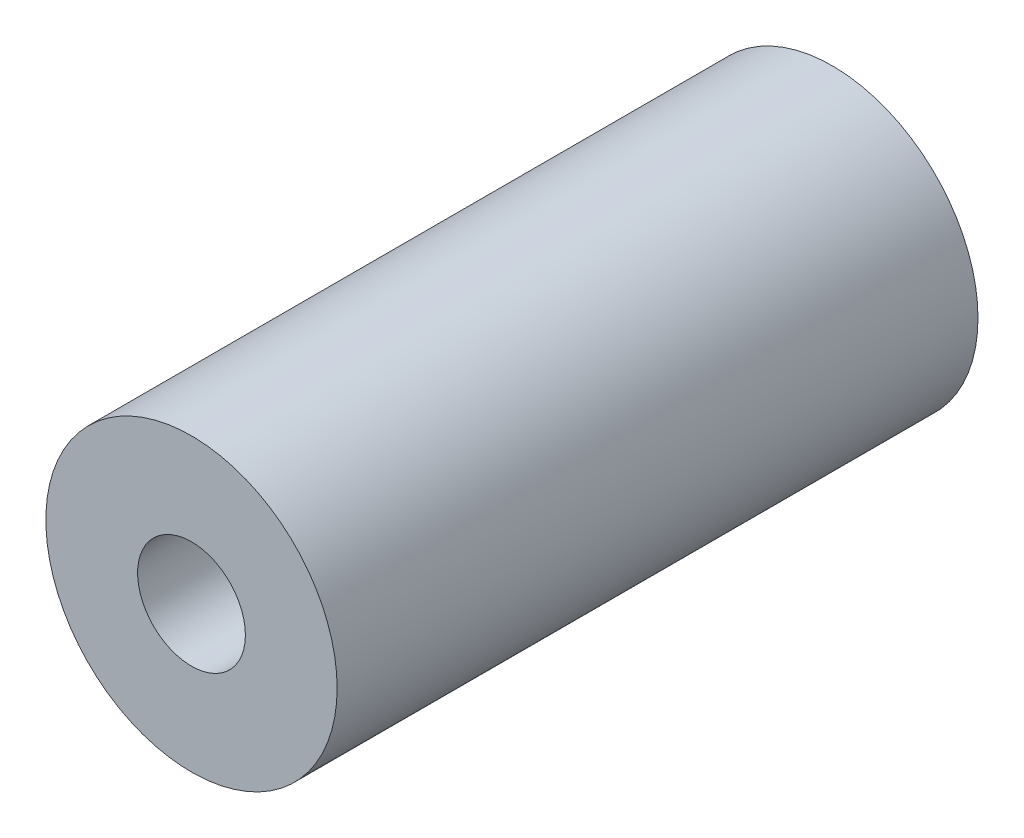
ISO-10303-21;
HEADER;
FILE_DESCRIPTION(('STEP AP214'),'2;1');
FILE_NAME('part.step','',(''),(''),'','','');
FILE_SCHEMA(('AUTOMOTIVE_DESIGN { 1 0 10303 214 1 1 1 1 }'));
ENDSEC;
DATA;
#1=APPLICATION_CONTEXT('core data for automotive mechanical design processes');
#2=APPLICATION_PROTOCOL_DEFINITION('international standard','automotive_design',2000,#1);
#3=PRODUCT_CONTEXT('',#1,'mechanical');
#4=PRODUCT('Part','Part','',(#3));
#5=PRODUCT_RELATED_PRODUCT_CATEGORY('part','',(#4));
#6=PRODUCT_DEFINITION_FORMATION('','',#4);
#7=PRODUCT_DEFINITION_CONTEXT('part definition',#1,'design');
#8=PRODUCT_DEFINITION('design','',#6,#7);
#9=PRODUCT_DEFINITION_SHAPE('','',#8);
#10=(LENGTH_UNIT() NAMED_UNIT(*) SI_UNIT(.MILLI.,.METRE.));
#11=(NAMED_UNIT(*) PLANE_ANGLE_UNIT() SI_UNIT($,.RADIAN.));
#12=(NAMED_UNIT(*) SI_UNIT($,.STERADIAN.) SOLID_ANGLE_UNIT());
#13=UNCERTAINTY_MEASURE_WITH_UNIT(LENGTH_MEASURE(1.E-05),#10,'distance_accuracy_value','');
#14=(GEOMETRIC_REPRESENTATION_CONTEXT(3) GLOBAL_UNCERTAINTY_ASSIGNED_CONTEXT((#13)) GLOBAL_UNIT_ASSIGNED_CONTEXT((#10,
#11,#12)) REPRESENTATION_CONTEXT('',''));
#15=CARTESIAN_POINT('',(0.,0.,0.));
#16=DIRECTION('',(0.,0.,1.));
#17=DIRECTION('',(1.,0.,0.));
#18=AXIS2_PLACEMENT_3D('',#15,#16,#17);
#19=CARTESIAN_POINT('',(0.,0.,22.));
#20=DIRECTION('',(0.,0.,1.));
#21=DIRECTION('',(1.,0.,0.));
#22=AXIS2_PLACEMENT_3D('',#19,#20,#21);
#23=PLANE('',#22);
#24=CARTESIAN_POINT('',(0.,0.,22.));
#25=DIRECTION('',(0.,0.,1.));
#26=DIRECTION('',(1.,0.,0.));
#27=AXIS2_PLACEMENT_3D('',#24,#25,#26);
#28=CIRCLE('',#27,5.);
#29=CARTESIAN_POINT('',(5.,0.,22.));
#30=VERTEX_POINT('',#29);
#31=EDGE_CURVE('E10',#30,#30,#28,.T.);
#32=ORIENTED_EDGE('',*,*,#31,.T.);
#33=EDGE_LOOP('',(#32));
#34=FACE_BOUND('',#33,.T.);
#35=CARTESIAN_POINT('',(0.,0.,22.));
#36=DIRECTION('',(0.,0.,1.));
#37=DIRECTION('',(1.,0.,0.));
#38=AXIS2_PLACEMENT_3D('',#35,#36,#37);
#39=CIRCLE('',#38,1.85);
#40=CARTESIAN_POINT('',(1.85,0.,22.));
#41=VERTEX_POINT('',#40);
#42=EDGE_CURVE('E42',#41,#41,#39,.T.);
#43=ORIENTED_EDGE('',*,*,#42,.F.);
#44=EDGE_LOOP('',(#43));
#45=FACE_BOUND('',#44,.T.);
#46=ADVANCED_FACE('F31',(#34,#45),#23,.T.);
#47=CARTESIAN_POINT('',(0.,0.,0.));
#48=DIRECTION('',(0.,0.,1.));
#49=DIRECTION('',(1.,0.,0.));
#50=AXIS2_PLACEMENT_3D('',#47,#48,#49);
#51=PLANE('',#50);
#52=CARTESIAN_POINT('',(0.,0.,0.));
#53=DIRECTION('',(0.,0.,1.));
#54=DIRECTION('',(1.,0.,0.));
#55=AXIS2_PLACEMENT_3D('',#52,#53,#54);
#56=CIRCLE('',#55,5.);
#57=CARTESIAN_POINT('',(5.,0.,0.));
#58=VERTEX_POINT('',#57);
#59=EDGE_CURVE('E35',#58,#58,#56,.T.);
#60=ORIENTED_EDGE('',*,*,#59,.F.);
#61=EDGE_LOOP('',(#60));
#62=FACE_BOUND('',#61,.T.);
#63=CARTESIAN_POINT('',(0.,0.,0.));
#64=DIRECTION('',(0.,0.,1.));
#65=DIRECTION('',(1.,0.,0.));
#66=AXIS2_PLACEMENT_3D('',#63,#64,#65);
#67=CIRCLE('',#66,1.85);
#68=CARTESIAN_POINT('',(1.85,0.,0.));
#69=VERTEX_POINT('',#68);
#70=EDGE_CURVE('E44',#69,#69,#67,.T.);
#71=ORIENTED_EDGE('',*,*,#70,.T.);
#72=EDGE_LOOP('',(#71));
#73=FACE_BOUND('',#72,.T.);
#74=ADVANCED_FACE('F54',(#62,#73),#51,.F.);
#75=CARTESIAN_POINT('',(0.,0.,22.));
#76=DIRECTION('',(0.,0.,-1.));
#77=DIRECTION('',(-1.,0.,0.));
#78=AXIS2_PLACEMENT_3D('',#75,#76,#77);
#79=CYLINDRICAL_SURFACE('',#78,5.);
#80=ORIENTED_EDGE('',*,*,#31,.F.);
#81=EDGE_LOOP('',(#80));
#82=FACE_BOUND('',#81,.T.);
#83=ORIENTED_EDGE('',*,*,#59,.T.);
#84=EDGE_LOOP('',(#83));
#85=FACE_BOUND('',#84,.T.);
#86=ADVANCED_FACE('F33',(#82,#85),#79,.T.);
#87=CARTESIAN_POINT('',(0.,0.,22.));
#88=DIRECTION('',(0.,0.,-1.));
#89=DIRECTION('',(-1.,0.,0.));
#90=AXIS2_PLACEMENT_3D('',#87,#88,#89);
#91=CYLINDRICAL_SURFACE('',#90,1.85);
#92=ORIENTED_EDGE('',*,*,#42,.T.);
#93=EDGE_LOOP('',(#92));
#94=FACE_BOUND('',#93,.T.);
#95=ORIENTED_EDGE('',*,*,#70,.F.);
#96=EDGE_LOOP('',(#95));
#97=FACE_BOUND('',#96,.T.);
#98=ADVANCED_FACE('F50',(#94,#97),#91,.F.);
#99=CLOSED_SHELL('',(#46,#74,#86,#98));
#100=MANIFOLD_SOLID_BREP('B2',#99);
#101=ADVANCED_BREP_SHAPE_REPRESENTATION('',(#18,#100),#14);
#102=SHAPE_DEFINITION_REPRESENTATION(#9,#101);
ENDSEC;
END-ISO-10303-21;
